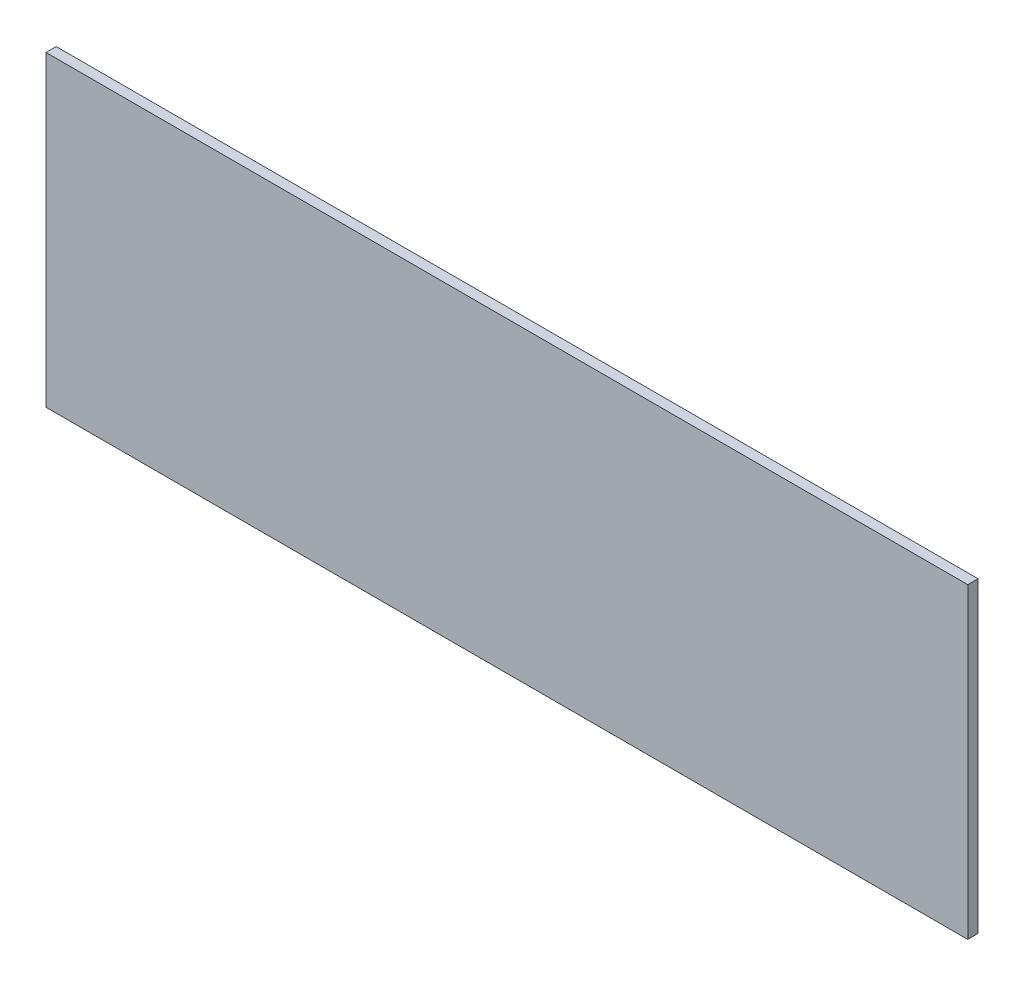
ISO-10303-21;
HEADER;
FILE_DESCRIPTION(('STEP AP214'),'2;1');
FILE_NAME('part.step','',(''),(''),'','','');
FILE_SCHEMA(('AUTOMOTIVE_DESIGN { 1 0 10303 214 1 1 1 1 }'));
ENDSEC;
DATA;
#1=APPLICATION_CONTEXT('core data for automotive mechanical design processes');
#2=APPLICATION_PROTOCOL_DEFINITION('international standard','automotive_design',2000,#1);
#3=PRODUCT_CONTEXT('',#1,'mechanical');
#4=PRODUCT('Part','Part','',(#3));
#5=PRODUCT_RELATED_PRODUCT_CATEGORY('part','',(#4));
#6=PRODUCT_DEFINITION_FORMATION('','',#4);
#7=PRODUCT_DEFINITION_CONTEXT('part definition',#1,'design');
#8=PRODUCT_DEFINITION('design','',#6,#7);
#9=PRODUCT_DEFINITION_SHAPE('','',#8);
#10=(LENGTH_UNIT() NAMED_UNIT(*) SI_UNIT(.MILLI.,.METRE.));
#11=(NAMED_UNIT(*) PLANE_ANGLE_UNIT() SI_UNIT($,.RADIAN.));
#12=(NAMED_UNIT(*) SI_UNIT($,.STERADIAN.) SOLID_ANGLE_UNIT());
#13=UNCERTAINTY_MEASURE_WITH_UNIT(LENGTH_MEASURE(1.E-05),#10,'distance_accuracy_value','');
#14=(GEOMETRIC_REPRESENTATION_CONTEXT(3) GLOBAL_UNCERTAINTY_ASSIGNED_CONTEXT((#13)) GLOBAL_UNIT_ASSIGNED_CONTEXT((#10,
#11,#12)) REPRESENTATION_CONTEXT('',''));
#15=CARTESIAN_POINT('',(0.,0.,0.));
#16=DIRECTION('',(0.,0.,1.));
#17=DIRECTION('',(1.,0.,0.));
#18=AXIS2_PLACEMENT_3D('',#15,#16,#17);
#19=CARTESIAN_POINT('',(0.,0.,0.));
#20=DIRECTION('',(0.,0.,-1.));
#21=DIRECTION('',(-1.,0.,0.));
#22=AXIS2_PLACEMENT_3D('',#19,#20,#21);
#23=PLANE('',#22);
#24=DIRECTION('',(0.,1.,0.));
#25=VECTOR('',#24,1.);
#26=CARTESIAN_POINT('',(450.,0.,0.));
#27=LINE('',#26,#25);
#28=CARTESIAN_POINT('',(450.,150.,0.));
#29=VERTEX_POINT('',#28);
#30=CARTESIAN_POINT('',(450.,0.,0.));
#31=VERTEX_POINT('',#30);
#32=EDGE_CURVE('E54',#29,#31,#27,.F.);
#33=ORIENTED_EDGE('',*,*,#32,.T.);
#34=DIRECTION('',(1.,0.,0.));
#35=VECTOR('',#34,1.);
#36=CARTESIAN_POINT('',(0.,0.,0.));
#37=LINE('',#36,#35);
#38=CARTESIAN_POINT('',(0.,0.,0.));
#39=VERTEX_POINT('',#38);
#40=EDGE_CURVE('E75',#31,#39,#37,.F.);
#41=ORIENTED_EDGE('',*,*,#40,.T.);
#42=DIRECTION('',(0.,1.,0.));
#43=VECTOR('',#42,1.);
#44=CARTESIAN_POINT('',(0.,0.,0.));
#45=LINE('',#44,#43);
#46=CARTESIAN_POINT('',(0.,150.,0.));
#47=VERTEX_POINT('',#46);
#48=EDGE_CURVE('E57',#39,#47,#45,.T.);
#49=ORIENTED_EDGE('',*,*,#48,.T.);
#50=DIRECTION('',(1.,0.,0.));
#51=VECTOR('',#50,1.);
#52=CARTESIAN_POINT('',(0.,150.,0.));
#53=LINE('',#52,#51);
#54=EDGE_CURVE('E19',#47,#29,#53,.T.);
#55=ORIENTED_EDGE('',*,*,#54,.T.);
#56=EDGE_LOOP('',(#33,#41,#49,#55));
#57=FACE_BOUND('',#56,.T.);
#58=ADVANCED_FACE('F16',(#57),#23,.T.);
#59=CARTESIAN_POINT('',(0.,150.,5.));
#60=DIRECTION('',(0.,-1.,0.));
#61=DIRECTION('',(0.,0.,-1.));
#62=AXIS2_PLACEMENT_3D('',#59,#60,#61);
#63=PLANE('',#62);
#64=DIRECTION('',(0.,0.,-1.));
#65=VECTOR('',#64,1.);
#66=CARTESIAN_POINT('',(0.,150.,5.));
#67=LINE('',#66,#65);
#68=CARTESIAN_POINT('',(0.,150.,5.));
#69=VERTEX_POINT('',#68);
#70=EDGE_CURVE('E77',#47,#69,#67,.F.);
#71=ORIENTED_EDGE('',*,*,#70,.T.);
#72=DIRECTION('',(-1.,0.,0.));
#73=VECTOR('',#72,1.);
#74=CARTESIAN_POINT('',(0.,150.,5.));
#75=LINE('',#74,#73);
#76=CARTESIAN_POINT('',(450.,150.,5.));
#77=VERTEX_POINT('',#76);
#78=EDGE_CURVE('E72',#69,#77,#75,.F.);
#79=ORIENTED_EDGE('',*,*,#78,.T.);
#80=DIRECTION('',(0.,0.,1.));
#81=VECTOR('',#80,1.);
#82=CARTESIAN_POINT('',(450.,150.,5.));
#83=LINE('',#82,#81);
#84=EDGE_CURVE('E62',#77,#29,#83,.F.);
#85=ORIENTED_EDGE('',*,*,#84,.T.);
#86=ORIENTED_EDGE('',*,*,#54,.F.);
#87=EDGE_LOOP('',(#71,#79,#85,#86));
#88=FACE_BOUND('',#87,.T.);
#89=ADVANCED_FACE('F71',(#88),#63,.F.);
#90=CARTESIAN_POINT('',(450.,0.,5.));
#91=DIRECTION('',(-1.,0.,0.));
#92=DIRECTION('',(0.,0.,1.));
#93=AXIS2_PLACEMENT_3D('',#90,#91,#92);
#94=PLANE('',#93);
#95=ORIENTED_EDGE('',*,*,#84,.F.);
#96=DIRECTION('',(0.,1.,0.));
#97=VECTOR('',#96,1.);
#98=CARTESIAN_POINT('',(450.,0.,5.));
#99=LINE('',#98,#97);
#100=CARTESIAN_POINT('',(450.,0.,5.));
#101=VERTEX_POINT('',#100);
#102=EDGE_CURVE('E82',#77,#101,#99,.F.);
#103=ORIENTED_EDGE('',*,*,#102,.T.);
#104=DIRECTION('',(0.,0.,1.));
#105=VECTOR('',#104,1.);
#106=CARTESIAN_POINT('',(450.,0.,5.));
#107=LINE('',#106,#105);
#108=EDGE_CURVE('E68',#101,#31,#107,.F.);
#109=ORIENTED_EDGE('',*,*,#108,.T.);
#110=ORIENTED_EDGE('',*,*,#32,.F.);
#111=EDGE_LOOP('',(#95,#103,#109,#110));
#112=FACE_BOUND('',#111,.T.);
#113=ADVANCED_FACE('F65',(#112),#94,.F.);
#114=CARTESIAN_POINT('',(0.,0.,5.));
#115=DIRECTION('',(0.,1.,0.));
#116=DIRECTION('',(0.,0.,1.));
#117=AXIS2_PLACEMENT_3D('',#114,#115,#116);
#118=PLANE('',#117);
#119=ORIENTED_EDGE('',*,*,#108,.F.);
#120=DIRECTION('',(-1.,0.,0.));
#121=VECTOR('',#120,1.);
#122=CARTESIAN_POINT('',(0.,0.,5.));
#123=LINE('',#122,#121);
#124=CARTESIAN_POINT('',(0.,0.,5.));
#125=VERTEX_POINT('',#124);
#126=EDGE_CURVE('E25',#101,#125,#123,.T.);
#127=ORIENTED_EDGE('',*,*,#126,.T.);
#128=DIRECTION('',(0.,0.,-1.));
#129=VECTOR('',#128,1.);
#130=CARTESIAN_POINT('',(0.,0.,5.));
#131=LINE('',#130,#129);
#132=EDGE_CURVE('E33',#125,#39,#131,.T.);
#133=ORIENTED_EDGE('',*,*,#132,.T.);
#134=ORIENTED_EDGE('',*,*,#40,.F.);
#135=EDGE_LOOP('',(#119,#127,#133,#134));
#136=FACE_BOUND('',#135,.T.);
#137=ADVANCED_FACE('F87',(#136),#118,.F.);
#138=CARTESIAN_POINT('',(0.,0.,5.));
#139=DIRECTION('',(1.,0.,0.));
#140=DIRECTION('',(0.,0.,-1.));
#141=AXIS2_PLACEMENT_3D('',#138,#139,#140);
#142=PLANE('',#141);
#143=ORIENTED_EDGE('',*,*,#132,.F.);
#144=DIRECTION('',(0.,1.,0.));
#145=VECTOR('',#144,1.);
#146=CARTESIAN_POINT('',(0.,0.,5.));
#147=LINE('',#146,#145);
#148=EDGE_CURVE('E10',#125,#69,#147,.T.);
#149=ORIENTED_EDGE('',*,*,#148,.T.);
#150=ORIENTED_EDGE('',*,*,#70,.F.);
#151=ORIENTED_EDGE('',*,*,#48,.F.);
#152=EDGE_LOOP('',(#143,#149,#150,#151));
#153=FACE_BOUND('',#152,.T.);
#154=ADVANCED_FACE('F90',(#153),#142,.F.);
#155=CARTESIAN_POINT('',(0.,0.,5.));
#156=DIRECTION('',(0.,0.,-1.));
#157=DIRECTION('',(-1.,0.,0.));
#158=AXIS2_PLACEMENT_3D('',#155,#156,#157);
#159=PLANE('',#158);
#160=ORIENTED_EDGE('',*,*,#126,.F.);
#161=ORIENTED_EDGE('',*,*,#102,.F.);
#162=ORIENTED_EDGE('',*,*,#78,.F.);
#163=ORIENTED_EDGE('',*,*,#148,.F.);
#164=EDGE_LOOP('',(#160,#161,#162,#163));
#165=FACE_BOUND('',#164,.T.);
#166=ADVANCED_FACE('F89',(#165),#159,.F.);
#167=CLOSED_SHELL('',(#58,#89,#113,#137,#154,#166));
#168=MANIFOLD_SOLID_BREP('B1',#167);
#169=ADVANCED_BREP_SHAPE_REPRESENTATION('',(#18,#168),#14);
#170=SHAPE_DEFINITION_REPRESENTATION(#9,#169);
ENDSEC;
END-ISO-10303-21;
